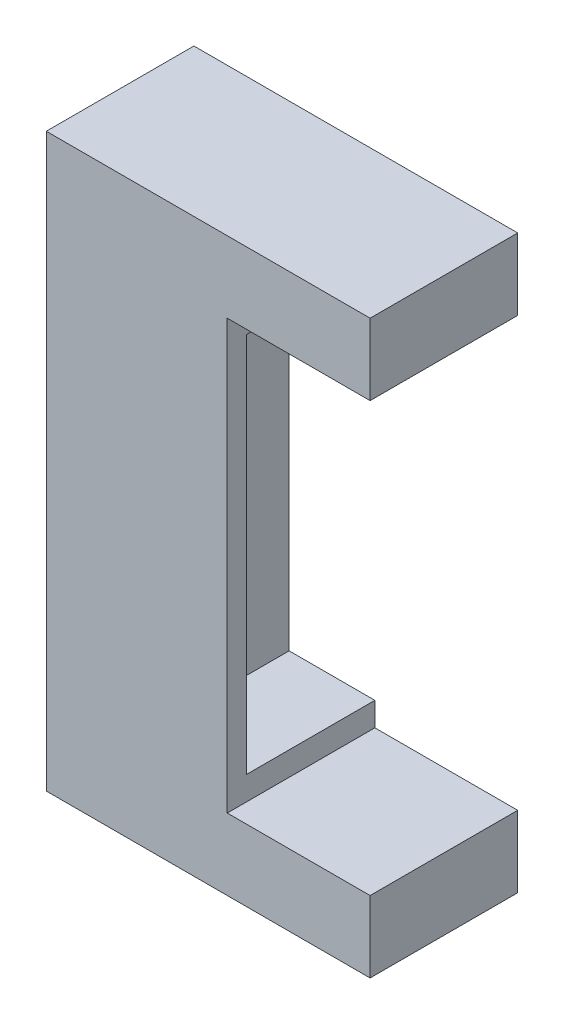
ISO-10303-21;
HEADER;
FILE_DESCRIPTION(('STEP AP214'),'2;1');
FILE_NAME('part.step','',(''),(''),'','','');
FILE_SCHEMA(('AUTOMOTIVE_DESIGN { 1 0 10303 214 1 1 1 1 }'));
ENDSEC;
DATA;
#1=APPLICATION_CONTEXT('core data for automotive mechanical design processes');
#2=APPLICATION_PROTOCOL_DEFINITION('international standard','automotive_design',2000,#1);
#3=PRODUCT_CONTEXT('',#1,'mechanical');
#4=PRODUCT('Part','Part','',(#3));
#5=PRODUCT_RELATED_PRODUCT_CATEGORY('part','',(#4));
#6=PRODUCT_DEFINITION_FORMATION('','',#4);
#7=PRODUCT_DEFINITION_CONTEXT('part definition',#1,'design');
#8=PRODUCT_DEFINITION('design','',#6,#7);
#9=PRODUCT_DEFINITION_SHAPE('','',#8);
#10=(LENGTH_UNIT() NAMED_UNIT(*) SI_UNIT(.MILLI.,.METRE.));
#11=(NAMED_UNIT(*) PLANE_ANGLE_UNIT() SI_UNIT($,.RADIAN.));
#12=(NAMED_UNIT(*) SI_UNIT($,.STERADIAN.) SOLID_ANGLE_UNIT());
#13=UNCERTAINTY_MEASURE_WITH_UNIT(LENGTH_MEASURE(1.E-05),#10,'distance_accuracy_value','');
#14=(GEOMETRIC_REPRESENTATION_CONTEXT(3) GLOBAL_UNCERTAINTY_ASSIGNED_CONTEXT((#13)) GLOBAL_UNIT_ASSIGNED_CONTEXT((#10,
#11,#12)) REPRESENTATION_CONTEXT('',''));
#15=CARTESIAN_POINT('',(0.,0.,0.));
#16=DIRECTION('',(0.,0.,1.));
#17=DIRECTION('',(1.,0.,0.));
#18=AXIS2_PLACEMENT_3D('',#15,#16,#17);
#19=CARTESIAN_POINT('',(-17.7000000000001,5.99999999999999,2.7));
#20=DIRECTION('',(-1.,0.,0.));
#21=DIRECTION('',(0.,0.,1.));
#22=AXIS2_PLACEMENT_3D('',#19,#20,#21);
#23=PLANE('',#22);
#24=DIRECTION('',(0.,1.,0.));
#25=VECTOR('',#24,1.);
#26=CARTESIAN_POINT('',(-17.7000000000001,5.99999999999999,0.));
#27=LINE('',#26,#25);
#28=CARTESIAN_POINT('',(-17.7000000000001,-6.00000000000002,0.));
#29=VERTEX_POINT('',#28);
#30=CARTESIAN_POINT('',(-17.7000000000001,-4.50000000000002,0.));
#31=VERTEX_POINT('',#30);
#32=EDGE_CURVE('E149',#29,#31,#27,.T.);
#33=ORIENTED_EDGE('',*,*,#32,.T.);
#34=DIRECTION('',(0.,0.,1.));
#35=VECTOR('',#34,1.);
#36=CARTESIAN_POINT('',(-17.7000000000001,-4.50000000000002,0.));
#37=LINE('',#36,#35);
#38=CARTESIAN_POINT('',(-17.7000000000001,-4.50000000000002,3.1));
#39=VERTEX_POINT('',#38);
#40=EDGE_CURVE('E186',#31,#39,#37,.T.);
#41=ORIENTED_EDGE('',*,*,#40,.T.);
#42=DIRECTION('',(0.,1.,0.));
#43=VECTOR('',#42,1.);
#44=CARTESIAN_POINT('',(-17.7000000000001,5.99999999999999,3.1));
#45=LINE('',#44,#43);
#46=CARTESIAN_POINT('',(-17.7000000000001,-6.00000000000002,3.1));
#47=VERTEX_POINT('',#46);
#48=EDGE_CURVE('E168',#47,#39,#45,.T.);
#49=ORIENTED_EDGE('',*,*,#48,.F.);
#50=DIRECTION('',(0.,0.,-1.));
#51=VECTOR('',#50,1.);
#52=CARTESIAN_POINT('',(-17.7000000000001,-6.00000000000002,2.7));
#53=LINE('',#52,#51);
#54=EDGE_CURVE('E45',#47,#29,#53,.T.);
#55=ORIENTED_EDGE('',*,*,#54,.T.);
#56=EDGE_LOOP('',(#33,#41,#49,#55));
#57=FACE_BOUND('',#56,.T.);
#58=ADVANCED_FACE('F37',(#57),#23,.F.);
#59=CARTESIAN_POINT('',(0.,0.,0.));
#60=DIRECTION('',(0.,0.,1.));
#61=DIRECTION('',(1.,0.,0.));
#62=AXIS2_PLACEMENT_3D('',#59,#60,#61);
#63=PLANE('',#62);
#64=DIRECTION('',(0.,-1.,0.));
#65=VECTOR('',#64,1.);
#66=CARTESIAN_POINT('',(-20.7000000000001,4.49999999999999,0.));
#67=LINE('',#66,#65);
#68=CARTESIAN_POINT('',(-20.7000000000001,-4.00000000000002,0.));
#69=VERTEX_POINT('',#68);
#70=CARTESIAN_POINT('',(-20.7000000000001,-4.50000000000002,0.));
#71=VERTEX_POINT('',#70);
#72=EDGE_CURVE('E132',#69,#71,#67,.T.);
#73=ORIENTED_EDGE('',*,*,#72,.T.);
#74=DIRECTION('',(1.,0.,0.));
#75=VECTOR('',#74,1.);
#76=CARTESIAN_POINT('',(-17.7000000000001,-4.50000000000002,0.));
#77=LINE('',#76,#75);
#78=EDGE_CURVE('E142',#71,#31,#77,.T.);
#79=ORIENTED_EDGE('',*,*,#78,.T.);
#80=ORIENTED_EDGE('',*,*,#32,.F.);
#81=DIRECTION('',(1.,0.,0.));
#82=VECTOR('',#81,1.);
#83=CARTESIAN_POINT('',(-24.5000000000001,-6.00000000000002,0.));
#84=LINE('',#83,#82);
#85=CARTESIAN_POINT('',(-24.5000000000001,-6.00000000000002,0.));
#86=VERTEX_POINT('',#85);
#87=EDGE_CURVE('E150',#86,#29,#84,.T.);
#88=ORIENTED_EDGE('',*,*,#87,.F.);
#89=DIRECTION('',(0.,-1.,0.));
#90=VECTOR('',#89,1.);
#91=CARTESIAN_POINT('',(-24.5000000000001,5.99999999999999,0.));
#92=LINE('',#91,#90);
#93=CARTESIAN_POINT('',(-24.5000000000001,5.99999999999999,0.));
#94=VERTEX_POINT('',#93);
#95=EDGE_CURVE('E153',#94,#86,#92,.T.);
#96=ORIENTED_EDGE('',*,*,#95,.F.);
#97=DIRECTION('',(-1.,0.,0.));
#98=VECTOR('',#97,1.);
#99=CARTESIAN_POINT('',(-24.5000000000001,5.99999999999999,0.));
#100=LINE('',#99,#98);
#101=CARTESIAN_POINT('',(-17.7000000000001,5.99999999999999,0.));
#102=VERTEX_POINT('',#101);
#103=EDGE_CURVE('E148',#102,#94,#100,.T.);
#104=ORIENTED_EDGE('',*,*,#103,.F.);
#105=CARTESIAN_POINT('',(-17.7000000000001,4.49999999999999,0.));
#106=VERTEX_POINT('',#105);
#107=EDGE_CURVE('E139',#106,#102,#27,.T.);
#108=ORIENTED_EDGE('',*,*,#107,.F.);
#109=DIRECTION('',(-1.,0.,0.));
#110=VECTOR('',#109,1.);
#111=CARTESIAN_POINT('',(-17.7000000000001,4.49999999999999,0.));
#112=LINE('',#111,#110);
#113=CARTESIAN_POINT('',(-20.7000000000001,4.49999999999999,0.));
#114=VERTEX_POINT('',#113);
#115=EDGE_CURVE('E127',#106,#114,#112,.T.);
#116=ORIENTED_EDGE('',*,*,#115,.T.);
#117=CARTESIAN_POINT('',(-20.7000000000001,3.99999999999999,0.));
#118=VERTEX_POINT('',#117);
#119=EDGE_CURVE('E176',#114,#118,#67,.T.);
#120=ORIENTED_EDGE('',*,*,#119,.T.);
#121=DIRECTION('',(-1.,0.,0.));
#122=VECTOR('',#121,1.);
#123=CARTESIAN_POINT('',(-22.5000000000001,3.99999999999999,0.));
#124=LINE('',#123,#122);
#125=CARTESIAN_POINT('',(-22.5000000000001,3.99999999999999,0.));
#126=VERTEX_POINT('',#125);
#127=EDGE_CURVE('E60',#118,#126,#124,.T.);
#128=ORIENTED_EDGE('',*,*,#127,.T.);
#129=DIRECTION('',(0.,-1.,0.));
#130=VECTOR('',#129,1.);
#131=CARTESIAN_POINT('',(-22.5000000000001,3.99999999999999,0.));
#132=LINE('',#131,#130);
#133=CARTESIAN_POINT('',(-22.5000000000001,-4.00000000000002,0.));
#134=VERTEX_POINT('',#133);
#135=EDGE_CURVE('E207',#126,#134,#132,.T.);
#136=ORIENTED_EDGE('',*,*,#135,.T.);
#137=DIRECTION('',(1.,0.,0.));
#138=VECTOR('',#137,1.);
#139=CARTESIAN_POINT('',(-22.5000000000001,-4.00000000000002,0.));
#140=LINE('',#139,#138);
#141=EDGE_CURVE('E218',#134,#69,#140,.T.);
#142=ORIENTED_EDGE('',*,*,#141,.T.);
#143=EDGE_LOOP('',(#73,#79,#80,#88,#96,#104,#108,#116,#120,#128,#136,#142));
#144=FACE_BOUND('',#143,.T.);
#145=ADVANCED_FACE('F146',(#144),#63,.F.);
#146=CARTESIAN_POINT('',(-24.5000000000001,5.99999999999999,2.7));
#147=DIRECTION('',(1.,0.,0.));
#148=DIRECTION('',(0.,0.,-1.));
#149=AXIS2_PLACEMENT_3D('',#146,#147,#148);
#150=PLANE('',#149);
#151=ORIENTED_EDGE('',*,*,#95,.T.);
#152=DIRECTION('',(0.,0.,-1.));
#153=VECTOR('',#152,1.);
#154=CARTESIAN_POINT('',(-24.5000000000001,-6.00000000000002,2.7));
#155=LINE('',#154,#153);
#156=CARTESIAN_POINT('',(-24.5000000000001,-6.00000000000002,3.1));
#157=VERTEX_POINT('',#156);
#158=EDGE_CURVE('E11',#157,#86,#155,.T.);
#159=ORIENTED_EDGE('',*,*,#158,.F.);
#160=DIRECTION('',(0.,-1.,0.));
#161=VECTOR('',#160,1.);
#162=CARTESIAN_POINT('',(-24.5000000000001,5.99999999999999,3.1));
#163=LINE('',#162,#161);
#164=CARTESIAN_POINT('',(-24.5000000000001,5.99999999999999,3.1));
#165=VERTEX_POINT('',#164);
#166=EDGE_CURVE('E198',#165,#157,#163,.T.);
#167=ORIENTED_EDGE('',*,*,#166,.F.);
#168=DIRECTION('',(0.,0.,-1.));
#169=VECTOR('',#168,1.);
#170=CARTESIAN_POINT('',(-24.5000000000001,5.99999999999999,2.7));
#171=LINE('',#170,#169);
#172=EDGE_CURVE('E158',#165,#94,#171,.T.);
#173=ORIENTED_EDGE('',*,*,#172,.T.);
#174=EDGE_LOOP('',(#151,#159,#167,#173));
#175=FACE_BOUND('',#174,.T.);
#176=ADVANCED_FACE('F39',(#175),#150,.F.);
#177=CARTESIAN_POINT('',(-24.5000000000001,-6.00000000000002,2.7));
#178=DIRECTION('',(0.,1.,0.));
#179=DIRECTION('',(-1.,0.,0.));
#180=AXIS2_PLACEMENT_3D('',#177,#178,#179);
#181=PLANE('',#180);
#182=ORIENTED_EDGE('',*,*,#87,.T.);
#183=ORIENTED_EDGE('',*,*,#54,.F.);
#184=DIRECTION('',(1.,0.,0.));
#185=VECTOR('',#184,1.);
#186=CARTESIAN_POINT('',(-24.5000000000001,-6.00000000000002,3.1));
#187=LINE('',#186,#185);
#188=EDGE_CURVE('E201',#157,#47,#187,.T.);
#189=ORIENTED_EDGE('',*,*,#188,.F.);
#190=ORIENTED_EDGE('',*,*,#158,.T.);
#191=EDGE_LOOP('',(#182,#183,#189,#190));
#192=FACE_BOUND('',#191,.T.);
#193=ADVANCED_FACE('F268',(#192),#181,.F.);
#194=CARTESIAN_POINT('',(-17.7000000000001,4.49999999999999,3.1));
#195=VERTEX_POINT('',#194);
#196=CARTESIAN_POINT('',(-17.7000000000001,5.99999999999999,3.1));
#197=VERTEX_POINT('',#196);
#198=EDGE_CURVE('E141',#195,#197,#45,.T.);
#199=ORIENTED_EDGE('',*,*,#198,.F.);
#200=DIRECTION('',(0.,0.,1.));
#201=VECTOR('',#200,1.);
#202=CARTESIAN_POINT('',(-17.7000000000001,4.49999999999999,0.));
#203=LINE('',#202,#201);
#204=EDGE_CURVE('E52',#106,#195,#203,.T.);
#205=ORIENTED_EDGE('',*,*,#204,.F.);
#206=ORIENTED_EDGE('',*,*,#107,.T.);
#207=DIRECTION('',(0.,0.,-1.));
#208=VECTOR('',#207,1.);
#209=CARTESIAN_POINT('',(-17.7000000000001,5.99999999999999,2.7));
#210=LINE('',#209,#208);
#211=EDGE_CURVE('E161',#197,#102,#210,.T.);
#212=ORIENTED_EDGE('',*,*,#211,.F.);
#213=EDGE_LOOP('',(#199,#205,#206,#212));
#214=FACE_BOUND('',#213,.T.);
#215=ADVANCED_FACE('F137',(#214),#23,.F.);
#216=CARTESIAN_POINT('',(-24.5000000000001,5.99999999999999,2.7));
#217=DIRECTION('',(0.,-1.,0.));
#218=DIRECTION('',(0.,0.,-1.));
#219=AXIS2_PLACEMENT_3D('',#216,#217,#218);
#220=PLANE('',#219);
#221=ORIENTED_EDGE('',*,*,#103,.T.);
#222=ORIENTED_EDGE('',*,*,#172,.F.);
#223=DIRECTION('',(-1.,0.,0.));
#224=VECTOR('',#223,1.);
#225=CARTESIAN_POINT('',(-24.5000000000001,5.99999999999999,3.1));
#226=LINE('',#225,#224);
#227=EDGE_CURVE('E204',#197,#165,#226,.T.);
#228=ORIENTED_EDGE('',*,*,#227,.F.);
#229=ORIENTED_EDGE('',*,*,#211,.T.);
#230=EDGE_LOOP('',(#221,#222,#228,#229));
#231=FACE_BOUND('',#230,.T.);
#232=ADVANCED_FACE('F230',(#231),#220,.F.);
#233=CARTESIAN_POINT('',(-22.5000000000001,3.99999999999999,2.7));
#234=DIRECTION('',(1.,0.,0.));
#235=DIRECTION('',(0.,0.,-1.));
#236=AXIS2_PLACEMENT_3D('',#233,#234,#235);
#237=PLANE('',#236);
#238=ORIENTED_EDGE('',*,*,#135,.F.);
#239=DIRECTION('',(0.,0.,-1.));
#240=VECTOR('',#239,1.);
#241=CARTESIAN_POINT('',(-22.5000000000001,3.99999999999999,2.7));
#242=LINE('',#241,#240);
#243=CARTESIAN_POINT('',(-22.5000000000001,3.99999999999999,2.7));
#244=VERTEX_POINT('',#243);
#245=EDGE_CURVE('E216',#244,#126,#242,.T.);
#246=ORIENTED_EDGE('',*,*,#245,.F.);
#247=DIRECTION('',(0.,-1.,0.));
#248=VECTOR('',#247,1.);
#249=CARTESIAN_POINT('',(-22.5000000000001,3.99999999999999,2.7));
#250=LINE('',#249,#248);
#251=CARTESIAN_POINT('',(-22.5000000000001,-4.00000000000002,2.7));
#252=VERTEX_POINT('',#251);
#253=EDGE_CURVE('E208',#244,#252,#250,.T.);
#254=ORIENTED_EDGE('',*,*,#253,.T.);
#255=DIRECTION('',(0.,0.,-1.));
#256=VECTOR('',#255,1.);
#257=CARTESIAN_POINT('',(-22.5000000000001,-4.00000000000002,2.7));
#258=LINE('',#257,#256);
#259=EDGE_CURVE('E223',#252,#134,#258,.T.);
#260=ORIENTED_EDGE('',*,*,#259,.T.);
#261=EDGE_LOOP('',(#238,#246,#254,#260));
#262=FACE_BOUND('',#261,.T.);
#263=ADVANCED_FACE('F244',(#262),#237,.T.);
#264=CARTESIAN_POINT('',(-22.5000000000001,-4.00000000000002,2.7));
#265=DIRECTION('',(0.,1.,0.));
#266=DIRECTION('',(0.,0.,1.));
#267=AXIS2_PLACEMENT_3D('',#264,#265,#266);
#268=PLANE('',#267);
#269=DIRECTION('',(0.,0.,1.));
#270=VECTOR('',#269,1.);
#271=CARTESIAN_POINT('',(-20.7000000000001,-4.00000000000002,2.7));
#272=LINE('',#271,#270);
#273=CARTESIAN_POINT('',(-20.7000000000001,-4.00000000000002,2.7));
#274=VERTEX_POINT('',#273);
#275=EDGE_CURVE('E196',#69,#274,#272,.T.);
#276=ORIENTED_EDGE('',*,*,#275,.F.);
#277=ORIENTED_EDGE('',*,*,#141,.F.);
#278=ORIENTED_EDGE('',*,*,#259,.F.);
#279=DIRECTION('',(1.,0.,0.));
#280=VECTOR('',#279,1.);
#281=CARTESIAN_POINT('',(-22.5000000000001,-4.00000000000002,2.7));
#282=LINE('',#281,#280);
#283=EDGE_CURVE('E211',#252,#274,#282,.T.);
#284=ORIENTED_EDGE('',*,*,#283,.T.);
#285=EDGE_LOOP('',(#276,#277,#278,#284));
#286=FACE_BOUND('',#285,.T.);
#287=ADVANCED_FACE('F248',(#286),#268,.T.);
#288=CARTESIAN_POINT('',(-22.5000000000001,3.99999999999999,2.7));
#289=DIRECTION('',(0.,-1.,0.));
#290=DIRECTION('',(0.,0.,-1.));
#291=AXIS2_PLACEMENT_3D('',#288,#289,#290);
#292=PLANE('',#291);
#293=DIRECTION('',(0.,0.,-1.));
#294=VECTOR('',#293,1.);
#295=CARTESIAN_POINT('',(-20.7000000000001,3.99999999999999,2.7));
#296=LINE('',#295,#294);
#297=CARTESIAN_POINT('',(-20.7000000000001,3.99999999999999,2.7));
#298=VERTEX_POINT('',#297);
#299=EDGE_CURVE('E194',#298,#118,#296,.T.);
#300=ORIENTED_EDGE('',*,*,#299,.F.);
#301=DIRECTION('',(-1.,0.,0.));
#302=VECTOR('',#301,1.);
#303=CARTESIAN_POINT('',(-22.5000000000001,3.99999999999999,2.7));
#304=LINE('',#303,#302);
#305=EDGE_CURVE('E214',#298,#244,#304,.T.);
#306=ORIENTED_EDGE('',*,*,#305,.T.);
#307=ORIENTED_EDGE('',*,*,#245,.T.);
#308=ORIENTED_EDGE('',*,*,#127,.F.);
#309=EDGE_LOOP('',(#300,#306,#307,#308));
#310=FACE_BOUND('',#309,.T.);
#311=ADVANCED_FACE('F239',(#310),#292,.T.);
#312=CARTESIAN_POINT('',(0.,0.,2.7));
#313=DIRECTION('',(0.,0.,1.));
#314=DIRECTION('',(1.,0.,0.));
#315=AXIS2_PLACEMENT_3D('',#312,#313,#314);
#316=PLANE('',#315);
#317=ORIENTED_EDGE('',*,*,#305,.F.);
#318=DIRECTION('',(0.,-1.,0.));
#319=VECTOR('',#318,1.);
#320=CARTESIAN_POINT('',(-20.7000000000001,0.,2.7));
#321=LINE('',#320,#319);
#322=EDGE_CURVE('E188',#298,#274,#321,.T.);
#323=ORIENTED_EDGE('',*,*,#322,.T.);
#324=ORIENTED_EDGE('',*,*,#283,.F.);
#325=ORIENTED_EDGE('',*,*,#253,.F.);
#326=EDGE_LOOP('',(#317,#323,#324,#325));
#327=FACE_BOUND('',#326,.T.);
#328=ADVANCED_FACE('F250',(#327),#316,.F.);
#329=CARTESIAN_POINT('',(0.,0.,3.1));
#330=DIRECTION('',(0.,0.,1.));
#331=DIRECTION('',(1.,0.,0.));
#332=AXIS2_PLACEMENT_3D('',#329,#330,#331);
#333=PLANE('',#332);
#334=DIRECTION('',(1.,0.,0.));
#335=VECTOR('',#334,1.);
#336=CARTESIAN_POINT('',(-17.7000000000001,-4.50000000000002,3.1));
#337=LINE('',#336,#335);
#338=CARTESIAN_POINT('',(-20.7000000000001,-4.50000000000002,3.1));
#339=VERTEX_POINT('',#338);
#340=EDGE_CURVE('E133',#339,#39,#337,.T.);
#341=ORIENTED_EDGE('',*,*,#340,.F.);
#342=DIRECTION('',(0.,-1.,0.));
#343=VECTOR('',#342,1.);
#344=CARTESIAN_POINT('',(-20.7000000000001,4.49999999999999,3.1));
#345=LINE('',#344,#343);
#346=CARTESIAN_POINT('',(-20.7000000000001,4.49999999999999,3.1));
#347=VERTEX_POINT('',#346);
#348=EDGE_CURVE('E182',#347,#339,#345,.T.);
#349=ORIENTED_EDGE('',*,*,#348,.F.);
#350=DIRECTION('',(-1.,0.,0.));
#351=VECTOR('',#350,1.);
#352=CARTESIAN_POINT('',(-17.7000000000001,4.49999999999999,3.1));
#353=LINE('',#352,#351);
#354=EDGE_CURVE('E180',#195,#347,#353,.T.);
#355=ORIENTED_EDGE('',*,*,#354,.F.);
#356=ORIENTED_EDGE('',*,*,#198,.T.);
#357=ORIENTED_EDGE('',*,*,#227,.T.);
#358=ORIENTED_EDGE('',*,*,#166,.T.);
#359=ORIENTED_EDGE('',*,*,#188,.T.);
#360=ORIENTED_EDGE('',*,*,#48,.T.);
#361=EDGE_LOOP('',(#341,#349,#355,#356,#357,#358,#359,#360));
#362=FACE_BOUND('',#361,.T.);
#363=ADVANCED_FACE('F233',(#362),#333,.T.);
#364=CARTESIAN_POINT('',(-17.7000000000001,-4.50000000000002,0.));
#365=DIRECTION('',(0.,-1.,0.));
#366=DIRECTION('',(0.,0.,-1.));
#367=AXIS2_PLACEMENT_3D('',#364,#365,#366);
#368=PLANE('',#367);
#369=ORIENTED_EDGE('',*,*,#340,.T.);
#370=ORIENTED_EDGE('',*,*,#40,.F.);
#371=ORIENTED_EDGE('',*,*,#78,.F.);
#372=DIRECTION('',(0.,0.,1.));
#373=VECTOR('',#372,1.);
#374=CARTESIAN_POINT('',(-20.7000000000001,-4.50000000000002,0.));
#375=LINE('',#374,#373);
#376=EDGE_CURVE('E189',#71,#339,#375,.T.);
#377=ORIENTED_EDGE('',*,*,#376,.T.);
#378=EDGE_LOOP('',(#369,#370,#371,#377));
#379=FACE_BOUND('',#378,.T.);
#380=ADVANCED_FACE('F257',(#379),#368,.F.);
#381=CARTESIAN_POINT('',(-20.7000000000001,4.49999999999999,0.));
#382=DIRECTION('',(-1.,0.,0.));
#383=DIRECTION('',(0.,0.,1.));
#384=AXIS2_PLACEMENT_3D('',#381,#382,#383);
#385=PLANE('',#384);
#386=ORIENTED_EDGE('',*,*,#275,.T.);
#387=ORIENTED_EDGE('',*,*,#322,.F.);
#388=ORIENTED_EDGE('',*,*,#299,.T.);
#389=ORIENTED_EDGE('',*,*,#119,.F.);
#390=DIRECTION('',(0.,0.,1.));
#391=VECTOR('',#390,1.);
#392=CARTESIAN_POINT('',(-20.7000000000001,4.49999999999999,0.));
#393=LINE('',#392,#391);
#394=EDGE_CURVE('E129',#114,#347,#393,.T.);
#395=ORIENTED_EDGE('',*,*,#394,.T.);
#396=ORIENTED_EDGE('',*,*,#348,.T.);
#397=ORIENTED_EDGE('',*,*,#376,.F.);
#398=ORIENTED_EDGE('',*,*,#72,.F.);
#399=EDGE_LOOP('',(#386,#387,#388,#389,#395,#396,#397,#398));
#400=FACE_BOUND('',#399,.T.);
#401=ADVANCED_FACE('F236',(#400),#385,.F.);
#402=CARTESIAN_POINT('',(-17.7000000000001,4.49999999999999,0.));
#403=DIRECTION('',(0.,1.,0.));
#404=DIRECTION('',(0.,0.,1.));
#405=AXIS2_PLACEMENT_3D('',#402,#403,#404);
#406=PLANE('',#405);
#407=ORIENTED_EDGE('',*,*,#354,.T.);
#408=ORIENTED_EDGE('',*,*,#394,.F.);
#409=ORIENTED_EDGE('',*,*,#115,.F.);
#410=ORIENTED_EDGE('',*,*,#204,.T.);
#411=EDGE_LOOP('',(#407,#408,#409,#410));
#412=FACE_BOUND('',#411,.T.);
#413=ADVANCED_FACE('F128',(#412),#406,.F.);
#414=CLOSED_SHELL('',(#58,#145,#176,#193,#215,#232,#263,#287,#311,#328,#363,#380,#401,#413));
#415=MANIFOLD_SOLID_BREP('B2',#414);
#416=ADVANCED_BREP_SHAPE_REPRESENTATION('',(#18,#415),#14);
#417=SHAPE_DEFINITION_REPRESENTATION(#9,#416);
ENDSEC;
END-ISO-10303-21;
